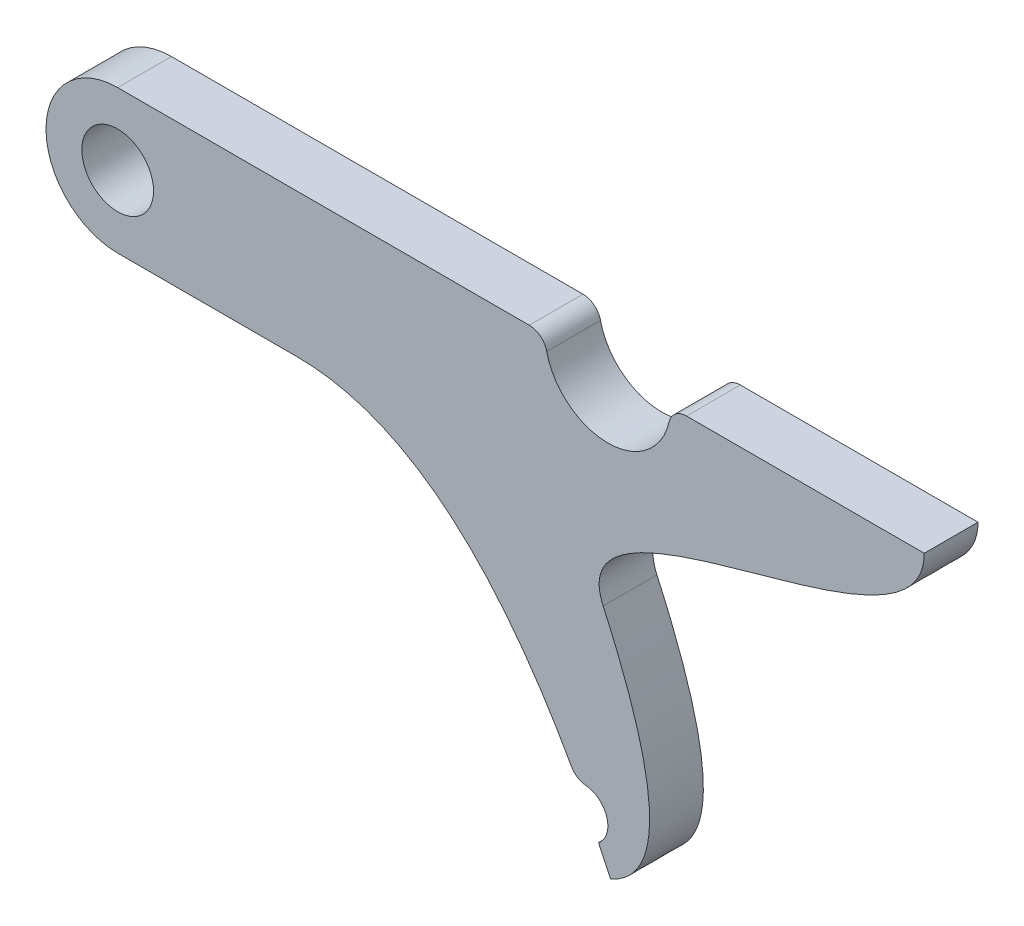
ISO-10303-21;
HEADER;
FILE_DESCRIPTION(('STEP AP214'),'2;1');
FILE_NAME('part.step','',(''),(''),'','','');
FILE_SCHEMA(('AUTOMOTIVE_DESIGN { 1 0 10303 214 1 1 1 1 }'));
ENDSEC;
DATA;
#1=APPLICATION_CONTEXT('core data for automotive mechanical design processes');
#2=APPLICATION_PROTOCOL_DEFINITION('international standard','automotive_design',2000,#1);
#3=PRODUCT_CONTEXT('',#1,'mechanical');
#4=PRODUCT('Part','Part','',(#3));
#5=PRODUCT_RELATED_PRODUCT_CATEGORY('part','',(#4));
#6=PRODUCT_DEFINITION_FORMATION('','',#4);
#7=PRODUCT_DEFINITION_CONTEXT('part definition',#1,'design');
#8=PRODUCT_DEFINITION('design','',#6,#7);
#9=PRODUCT_DEFINITION_SHAPE('','',#8);
#10=(LENGTH_UNIT() NAMED_UNIT(*) SI_UNIT(.MILLI.,.METRE.));
#11=(NAMED_UNIT(*) PLANE_ANGLE_UNIT() SI_UNIT($,.RADIAN.));
#12=(NAMED_UNIT(*) SI_UNIT($,.STERADIAN.) SOLID_ANGLE_UNIT());
#13=UNCERTAINTY_MEASURE_WITH_UNIT(LENGTH_MEASURE(1.E-05),#10,'distance_accuracy_value','');
#14=(GEOMETRIC_REPRESENTATION_CONTEXT(3) GLOBAL_UNCERTAINTY_ASSIGNED_CONTEXT((#13)) GLOBAL_UNIT_ASSIGNED_CONTEXT((#10,
#11,#12)) REPRESENTATION_CONTEXT('',''));
#15=CARTESIAN_POINT('',(0.,0.,0.));
#16=DIRECTION('',(0.,0.,1.));
#17=DIRECTION('',(1.,0.,0.));
#18=AXIS2_PLACEMENT_3D('',#15,#16,#17);
#19=CARTESIAN_POINT('',(0.,4.,3.));
#20=DIRECTION('',(0.,1.,0.));
#21=DIRECTION('',(0.,0.,1.));
#22=AXIS2_PLACEMENT_3D('',#19,#20,#21);
#23=PLANE('',#22);
#24=DIRECTION('',(1.,0.,0.));
#25=VECTOR('',#24,1.);
#26=CARTESIAN_POINT('',(0.,4.,3.));
#27=LINE('',#26,#25);
#28=CARTESIAN_POINT('',(0.,4.,3.));
#29=VERTEX_POINT('',#28);
#30=CARTESIAN_POINT('',(22.9625178063039,4.,3.));
#31=VERTEX_POINT('',#30);
#32=EDGE_CURVE('E131',#29,#31,#27,.T.);
#33=ORIENTED_EDGE('',*,*,#32,.T.);
#34=DIRECTION('',(0.,0.,-1.));
#35=VECTOR('',#34,1.);
#36=CARTESIAN_POINT('',(22.9625178063039,4.,0.));
#37=LINE('',#36,#35);
#38=CARTESIAN_POINT('',(22.9625178063039,4.,0.));
#39=VERTEX_POINT('',#38);
#40=EDGE_CURVE('E11',#31,#39,#37,.T.);
#41=ORIENTED_EDGE('',*,*,#40,.T.);
#42=DIRECTION('',(1.,0.,0.));
#43=VECTOR('',#42,1.);
#44=CARTESIAN_POINT('',(0.,4.,0.));
#45=LINE('',#44,#43);
#46=CARTESIAN_POINT('',(0.,4.,0.));
#47=VERTEX_POINT('',#46);
#48=EDGE_CURVE('E134',#47,#39,#45,.T.);
#49=ORIENTED_EDGE('',*,*,#48,.F.);
#50=DIRECTION('',(0.,0.,-1.));
#51=VECTOR('',#50,1.);
#52=CARTESIAN_POINT('',(0.,4.,3.));
#53=LINE('',#52,#51);
#54=EDGE_CURVE('E129',#29,#47,#53,.T.);
#55=ORIENTED_EDGE('',*,*,#54,.F.);
#56=EDGE_LOOP('',(#33,#41,#49,#55));
#57=FACE_BOUND('',#56,.T.);
#58=ADVANCED_FACE('F35',(#57),#23,.T.);
#59=CARTESIAN_POINT('',(31.7374821936961,4.,0.));
#60=VERTEX_POINT('',#59);
#61=CARTESIAN_POINT('',(45.,4.,0.));
#62=VERTEX_POINT('',#61);
#63=EDGE_CURVE('E343',#60,#62,#45,.T.);
#64=ORIENTED_EDGE('',*,*,#63,.F.);
#65=DIRECTION('',(0.,0.,-1.));
#66=VECTOR('',#65,1.);
#67=CARTESIAN_POINT('',(31.7374821936961,4.,3.));
#68=LINE('',#67,#66);
#69=CARTESIAN_POINT('',(31.7374821936961,4.,3.));
#70=VERTEX_POINT('',#69);
#71=EDGE_CURVE('E43',#60,#70,#68,.F.);
#72=ORIENTED_EDGE('',*,*,#71,.T.);
#73=CARTESIAN_POINT('',(45.,4.,3.));
#74=VERTEX_POINT('',#73);
#75=EDGE_CURVE('E149',#70,#74,#27,.T.);
#76=ORIENTED_EDGE('',*,*,#75,.T.);
#77=DIRECTION('',(0.,0.,-1.));
#78=VECTOR('',#77,1.);
#79=CARTESIAN_POINT('',(45.,4.,3.));
#80=LINE('',#79,#78);
#81=EDGE_CURVE('E333',#74,#62,#80,.T.);
#82=ORIENTED_EDGE('',*,*,#81,.T.);
#83=EDGE_LOOP('',(#64,#72,#76,#82));
#84=FACE_BOUND('',#83,.T.);
#85=ADVANCED_FACE('F187',(#84),#23,.T.);
#86=CARTESIAN_POINT('',(0.,0.,3.));
#87=DIRECTION('',(0.,0.,-1.));
#88=DIRECTION('',(-1.,0.,0.));
#89=AXIS2_PLACEMENT_3D('',#86,#87,#88);
#90=CYLINDRICAL_SURFACE('',#89,4.);
#91=CARTESIAN_POINT('',(0.,0.,0.));
#92=DIRECTION('',(0.,0.,1.));
#93=DIRECTION('',(1.,0.,0.));
#94=AXIS2_PLACEMENT_3D('',#91,#92,#93);
#95=CIRCLE('',#94,4.);
#96=CARTESIAN_POINT('',(0.,-4.,0.));
#97=VERTEX_POINT('',#96);
#98=EDGE_CURVE('E342',#47,#97,#95,.T.);
#99=ORIENTED_EDGE('',*,*,#98,.T.);
#100=DIRECTION('',(0.,0.,-1.));
#101=VECTOR('',#100,1.);
#102=CARTESIAN_POINT('',(0.,-4.,3.));
#103=LINE('',#102,#101);
#104=CARTESIAN_POINT('',(0.,-4.,3.));
#105=VERTEX_POINT('',#104);
#106=EDGE_CURVE('E138',#105,#97,#103,.T.);
#107=ORIENTED_EDGE('',*,*,#106,.F.);
#108=CARTESIAN_POINT('',(0.,0.,3.));
#109=DIRECTION('',(0.,0.,1.));
#110=DIRECTION('',(1.,0.,0.));
#111=AXIS2_PLACEMENT_3D('',#108,#109,#110);
#112=CIRCLE('',#111,4.);
#113=EDGE_CURVE('E141',#29,#105,#112,.T.);
#114=ORIENTED_EDGE('',*,*,#113,.F.);
#115=ORIENTED_EDGE('',*,*,#54,.T.);
#116=EDGE_LOOP('',(#99,#107,#114,#115));
#117=FACE_BOUND('',#116,.T.);
#118=ADVANCED_FACE('F142',(#117),#90,.T.);
#119=CARTESIAN_POINT('',(0.,-4.,3.));
#120=DIRECTION('',(0.,1.,0.));
#121=DIRECTION('',(0.,0.,1.));
#122=AXIS2_PLACEMENT_3D('',#119,#120,#121);
#123=PLANE('',#122);
#124=DIRECTION('',(1.,0.,0.));
#125=VECTOR('',#124,1.);
#126=CARTESIAN_POINT('',(0.,-4.,0.));
#127=LINE('',#126,#125);
#128=CARTESIAN_POINT('',(10.,-4.,0.));
#129=VERTEX_POINT('',#128);
#130=EDGE_CURVE('E345',#97,#129,#127,.T.);
#131=ORIENTED_EDGE('',*,*,#130,.T.);
#132=DIRECTION('',(0.,0.,-1.));
#133=VECTOR('',#132,1.);
#134=CARTESIAN_POINT('',(10.,-4.,3.));
#135=LINE('',#134,#133);
#136=CARTESIAN_POINT('',(10.,-4.,3.));
#137=VERTEX_POINT('',#136);
#138=EDGE_CURVE('E383',#137,#129,#135,.T.);
#139=ORIENTED_EDGE('',*,*,#138,.F.);
#140=DIRECTION('',(1.,0.,0.));
#141=VECTOR('',#140,1.);
#142=CARTESIAN_POINT('',(0.,-4.,3.));
#143=LINE('',#142,#141);
#144=EDGE_CURVE('E145',#105,#137,#143,.T.);
#145=ORIENTED_EDGE('',*,*,#144,.F.);
#146=ORIENTED_EDGE('',*,*,#106,.T.);
#147=EDGE_LOOP('',(#131,#139,#145,#146));
#148=FACE_BOUND('',#147,.T.);
#149=ADVANCED_FACE('F181',(#148),#123,.F.);
#150=CARTESIAN_POINT('',(10.,-4.,3.));
#151=CARTESIAN_POINT('',(20.,-4.,3.));
#152=CARTESIAN_POINT('',(27.5,-20.5,3.));
#153=B_SPLINE_CURVE_WITH_KNOTS('',2,(#150,#151,#152),.UNSPECIFIED.,.F.,.F.,(3,3),(0.,1.),.UNSPECIFIED.);
#154=DIRECTION('',(0.,0.,-1.));
#155=VECTOR('',#154,1.);
#156=SURFACE_OF_LINEAR_EXTRUSION('',#153,#155);
#157=CARTESIAN_POINT('',(10.,-4.,0.));
#158=CARTESIAN_POINT('',(20.,-4.,0.));
#159=CARTESIAN_POINT('',(27.5,-20.5,0.));
#160=B_SPLINE_CURVE_WITH_KNOTS('',2,(#157,#158,#159),.UNSPECIFIED.,.F.,.F.,(3,3),(0.,1.),.UNSPECIFIED.);
#161=CARTESIAN_POINT('',(25.3175861867431,-16.1430948860606,0.));
#162=VERTEX_POINT('',#161);
#163=EDGE_CURVE('E347',#129,#162,#160,.T.);
#164=ORIENTED_EDGE('',*,*,#163,.T.);
#165=DIRECTION('',(0.,0.,-1.));
#166=VECTOR('',#165,1.);
#167=CARTESIAN_POINT('',(25.3175861867427,-16.1430948860598,0.));
#168=LINE('',#167,#166);
#169=CARTESIAN_POINT('',(25.3175861867431,-16.1430948860606,3.));
#170=VERTEX_POINT('',#169);
#171=EDGE_CURVE('E398',#162,#170,#168,.F.);
#172=ORIENTED_EDGE('',*,*,#171,.T.);
#173=EDGE_CURVE('E157',#137,#170,#153,.T.);
#174=ORIENTED_EDGE('',*,*,#173,.F.);
#175=ORIENTED_EDGE('',*,*,#138,.T.);
#176=EDGE_LOOP('',(#164,#172,#174,#175));
#177=FACE_BOUND('',#176,.T.);
#178=ADVANCED_FACE('F176',(#177),#156,.F.);
#179=CARTESIAN_POINT('',(26.,-18.,3.));
#180=DIRECTION('',(0.,0.,-1.));
#181=DIRECTION('',(-1.,0.,0.));
#182=AXIS2_PLACEMENT_3D('',#179,#180,#181);
#183=CYLINDRICAL_SURFACE('',#182,1.35);
#184=CARTESIAN_POINT('',(26.,-18.,3.));
#185=DIRECTION('',(0.,0.,1.));
#186=DIRECTION('',(1.,0.,0.));
#187=AXIS2_PLACEMENT_3D('',#184,#185,#186);
#188=CIRCLE('',#187,1.35);
#189=CARTESIAN_POINT('',(26.8284055247011,-19.0659476003278,3.));
#190=VERTEX_POINT('',#189);
#191=CARTESIAN_POINT('',(26.1102786785099,-16.6545117566229,3.));
#192=VERTEX_POINT('',#191);
#193=EDGE_CURVE('E162',#190,#192,#188,.T.);
#194=ORIENTED_EDGE('',*,*,#193,.T.);
#195=DIRECTION('',(0.,0.,-1.));
#196=VECTOR('',#195,1.);
#197=CARTESIAN_POINT('',(26.1102786785099,-16.6545117566229,3.));
#198=LINE('',#197,#196);
#199=CARTESIAN_POINT('',(26.1102786785099,-16.6545117566229,0.));
#200=VERTEX_POINT('',#199);
#201=EDGE_CURVE('E389',#192,#200,#198,.T.);
#202=ORIENTED_EDGE('',*,*,#201,.T.);
#203=CARTESIAN_POINT('',(26.,-18.,0.));
#204=DIRECTION('',(0.,0.,1.));
#205=DIRECTION('',(1.,0.,0.));
#206=AXIS2_PLACEMENT_3D('',#203,#204,#205);
#207=CIRCLE('',#206,1.35);
#208=CARTESIAN_POINT('',(26.8284055247011,-19.0659476003278,0.));
#209=VERTEX_POINT('',#208);
#210=EDGE_CURVE('E352',#209,#200,#207,.T.);
#211=ORIENTED_EDGE('',*,*,#210,.F.);
#212=DIRECTION('',(0.,0.,-1.));
#213=VECTOR('',#212,1.);
#214=CARTESIAN_POINT('',(26.8284055247011,-19.0659476003278,3.));
#215=LINE('',#214,#213);
#216=EDGE_CURVE('E381',#190,#209,#215,.T.);
#217=ORIENTED_EDGE('',*,*,#216,.F.);
#218=EDGE_LOOP('',(#194,#202,#211,#217));
#219=FACE_BOUND('',#218,.T.);
#220=ADVANCED_FACE('F174',(#219),#183,.F.);
#221=CARTESIAN_POINT('',(27.5,-20.5,0.));
#222=VERTEX_POINT('',#221);
#223=EDGE_CURVE('E353',#209,#222,#160,.T.);
#224=ORIENTED_EDGE('',*,*,#223,.T.);
#225=DIRECTION('',(0.,0.,-1.));
#226=VECTOR('',#225,1.);
#227=CARTESIAN_POINT('',(27.5,-20.5,3.));
#228=LINE('',#227,#226);
#229=CARTESIAN_POINT('',(27.5,-20.5,3.));
#230=VERTEX_POINT('',#229);
#231=EDGE_CURVE('E378',#230,#222,#228,.T.);
#232=ORIENTED_EDGE('',*,*,#231,.F.);
#233=EDGE_CURVE('E163',#190,#230,#153,.T.);
#234=ORIENTED_EDGE('',*,*,#233,.F.);
#235=ORIENTED_EDGE('',*,*,#216,.T.);
#236=EDGE_LOOP('',(#224,#232,#234,#235));
#237=FACE_BOUND('',#236,.T.);
#238=ADVANCED_FACE('F169',(#237),#156,.F.);
#239=CARTESIAN_POINT('',(27.5,-20.5,3.));
#240=CARTESIAN_POINT('',(32.051832387313,-18.4309852784941,3.));
#241=CARTESIAN_POINT('',(27.0861970556988,-7.50658754894282,3.));
#242=B_SPLINE_CURVE_WITH_KNOTS('',2,(#239,#240,#241),.UNSPECIFIED.,.F.,.F.,(3,3),(0.,1.),.UNSPECIFIED.);
#243=DIRECTION('',(0.,0.,-1.));
#244=VECTOR('',#243,1.);
#245=SURFACE_OF_LINEAR_EXTRUSION('',#242,#244);
#246=CARTESIAN_POINT('',(27.5,-20.5,0.));
#247=CARTESIAN_POINT('',(32.051832387313,-18.4309852784941,0.));
#248=CARTESIAN_POINT('',(27.0861970556988,-7.50658754894282,0.));
#249=B_SPLINE_CURVE_WITH_KNOTS('',2,(#246,#247,#248),.UNSPECIFIED.,.F.,.F.,(3,3),(0.,1.),.UNSPECIFIED.);
#250=CARTESIAN_POINT('',(27.0861970556988,-7.50658754894282,0.));
#251=VERTEX_POINT('',#250);
#252=EDGE_CURVE('E359',#222,#251,#249,.T.);
#253=ORIENTED_EDGE('',*,*,#252,.T.);
#254=DIRECTION('',(0.,0.,-1.));
#255=VECTOR('',#254,1.);
#256=CARTESIAN_POINT('',(27.0861970556988,-7.50658754894282,3.));
#257=LINE('',#256,#255);
#258=CARTESIAN_POINT('',(27.0861970556988,-7.50658754894282,3.));
#259=VERTEX_POINT('',#258);
#260=EDGE_CURVE('E375',#259,#251,#257,.T.);
#261=ORIENTED_EDGE('',*,*,#260,.F.);
#262=EDGE_CURVE('E334',#230,#259,#242,.T.);
#263=ORIENTED_EDGE('',*,*,#262,.F.);
#264=ORIENTED_EDGE('',*,*,#231,.T.);
#265=EDGE_LOOP('',(#253,#261,#263,#264));
#266=FACE_BOUND('',#265,.T.);
#267=ADVANCED_FACE('F173',(#266),#245,.F.);
#268=CARTESIAN_POINT('',(27.0861970556988,-7.50658754894282,3.));
#269=CARTESIAN_POINT('',(25.4922936243612,-4.,3.));
#270=CARTESIAN_POINT('',(31.4922936243612,-1.5,3.));
#271=CARTESIAN_POINT('',(45.,-1.5,3.));
#272=CARTESIAN_POINT('',(45.,4.,3.));
#273=B_SPLINE_CURVE_WITH_KNOTS('',4,(#268,#269,#270,#271,#272),.UNSPECIFIED.,.F.,.F.,(5,5),(0.,
1.),.UNSPECIFIED.);
#274=DIRECTION('',(0.,0.,-1.));
#275=VECTOR('',#274,1.);
#276=SURFACE_OF_LINEAR_EXTRUSION('',#273,#275);
#277=CARTESIAN_POINT('',(27.0861970556988,-7.50658754894282,0.));
#278=CARTESIAN_POINT('',(25.4922936243612,-4.,0.));
#279=CARTESIAN_POINT('',(31.4922936243612,-1.5,0.));
#280=CARTESIAN_POINT('',(45.,-1.5,0.));
#281=CARTESIAN_POINT('',(45.,4.,0.));
#282=B_SPLINE_CURVE_WITH_KNOTS('',4,(#277,#278,#279,#280,#281),.UNSPECIFIED.,.F.,.F.,(5,5),(0.,
1.),.UNSPECIFIED.);
#283=EDGE_CURVE('E151',#251,#62,#282,.T.);
#284=ORIENTED_EDGE('',*,*,#283,.T.);
#285=ORIENTED_EDGE('',*,*,#81,.F.);
#286=EDGE_CURVE('E327',#259,#74,#273,.T.);
#287=ORIENTED_EDGE('',*,*,#286,.F.);
#288=ORIENTED_EDGE('',*,*,#260,.T.);
#289=EDGE_LOOP('',(#284,#285,#287,#288));
#290=FACE_BOUND('',#289,.T.);
#291=ADVANCED_FACE('F239',(#290),#276,.F.);
#292=CARTESIAN_POINT('',(0.,0.,3.));
#293=DIRECTION('',(0.,0.,1.));
#294=DIRECTION('',(1.,0.,0.));
#295=AXIS2_PLACEMENT_3D('',#292,#293,#294);
#296=PLANE('',#295);
#297=CARTESIAN_POINT('',(0.,0.,3.));
#298=DIRECTION('',(0.,0.,1.));
#299=DIRECTION('',(1.,0.,0.));
#300=AXIS2_PLACEMENT_3D('',#297,#298,#299);
#301=CIRCLE('',#300,2.);
#302=CARTESIAN_POINT('',(2.,0.,3.));
#303=VERTEX_POINT('',#302);
#304=EDGE_CURVE('E416',#303,#303,#301,.T.);
#305=ORIENTED_EDGE('',*,*,#304,.F.);
#306=EDGE_LOOP('',(#305));
#307=FACE_BOUND('',#306,.T.);
#308=ORIENTED_EDGE('',*,*,#173,.T.);
#309=CARTESIAN_POINT('',(26.1919665885173,-15.6578537985657,3.));
#310=DIRECTION('',(0.,0.,1.));
#311=DIRECTION('',(1.,0.,0.));
#312=AXIS2_PLACEMENT_3D('',#309,#310,#311);
#313=CIRCLE('',#312,1.);
#314=EDGE_CURVE('E403',#170,#192,#313,.T.);
#315=ORIENTED_EDGE('',*,*,#314,.T.);
#316=ORIENTED_EDGE('',*,*,#193,.F.);
#317=ORIENTED_EDGE('',*,*,#233,.T.);
#318=ORIENTED_EDGE('',*,*,#262,.T.);
#319=ORIENTED_EDGE('',*,*,#286,.T.);
#320=ORIENTED_EDGE('',*,*,#75,.F.);
#321=CARTESIAN_POINT('',(31.7374821936961,3.,3.));
#322=DIRECTION('',(0.,0.,1.));
#323=DIRECTION('',(1.,0.,0.));
#324=AXIS2_PLACEMENT_3D('',#321,#322,#323);
#325=CIRCLE('',#324,1.);
#326=CARTESIAN_POINT('',(30.7624861506525,3.22222222222222,3.));
#327=VERTEX_POINT('',#326);
#328=EDGE_CURVE('E401',#70,#327,#325,.T.);
#329=ORIENTED_EDGE('',*,*,#328,.T.);
#330=CARTESIAN_POINT('',(27.35,4.,3.));
#331=DIRECTION('',(0.,0.,1.));
#332=DIRECTION('',(1.,0.,0.));
#333=AXIS2_PLACEMENT_3D('',#330,#331,#332);
#334=CIRCLE('',#333,3.5);
#335=CARTESIAN_POINT('',(23.9375138493475,3.22222222222222,3.));
#336=VERTEX_POINT('',#335);
#337=EDGE_CURVE('E153',#336,#327,#334,.T.);
#338=ORIENTED_EDGE('',*,*,#337,.F.);
#339=CARTESIAN_POINT('',(22.9625178063039,3.,3.));
#340=DIRECTION('',(0.,0.,1.));
#341=DIRECTION('',(1.,0.,0.));
#342=AXIS2_PLACEMENT_3D('',#339,#340,#341);
#343=CIRCLE('',#342,1.);
#344=EDGE_CURVE('E57',#336,#31,#343,.T.);
#345=ORIENTED_EDGE('',*,*,#344,.T.);
#346=ORIENTED_EDGE('',*,*,#32,.F.);
#347=ORIENTED_EDGE('',*,*,#113,.T.);
#348=ORIENTED_EDGE('',*,*,#144,.T.);
#349=EDGE_LOOP('',(#308,#315,#316,#317,#318,#319,#320,#329,#338,#345,#346,#347,#348));
#350=FACE_BOUND('',#349,.T.);
#351=ADVANCED_FACE('F148',(#307,#350),#296,.T.);
#352=CARTESIAN_POINT('',(0.,0.,0.));
#353=DIRECTION('',(0.,0.,1.));
#354=DIRECTION('',(1.,0.,0.));
#355=AXIS2_PLACEMENT_3D('',#352,#353,#354);
#356=PLANE('',#355);
#357=CARTESIAN_POINT('',(0.,0.,0.));
#358=DIRECTION('',(0.,0.,1.));
#359=DIRECTION('',(1.,0.,0.));
#360=AXIS2_PLACEMENT_3D('',#357,#358,#359);
#361=CIRCLE('',#360,2.);
#362=CARTESIAN_POINT('',(2.,0.,0.));
#363=VERTEX_POINT('',#362);
#364=EDGE_CURVE('E418',#363,#363,#361,.T.);
#365=ORIENTED_EDGE('',*,*,#364,.T.);
#366=EDGE_LOOP('',(#365));
#367=FACE_BOUND('',#366,.T.);
#368=ORIENTED_EDGE('',*,*,#210,.T.);
#369=CARTESIAN_POINT('',(26.1919665885173,-15.6578537985657,0.));
#370=DIRECTION('',(0.,0.,1.));
#371=DIRECTION('',(1.,0.,0.));
#372=AXIS2_PLACEMENT_3D('',#369,#370,#371);
#373=CIRCLE('',#372,1.);
#374=EDGE_CURVE('E396',#200,#162,#373,.F.);
#375=ORIENTED_EDGE('',*,*,#374,.T.);
#376=ORIENTED_EDGE('',*,*,#163,.F.);
#377=ORIENTED_EDGE('',*,*,#130,.F.);
#378=ORIENTED_EDGE('',*,*,#98,.F.);
#379=ORIENTED_EDGE('',*,*,#48,.T.);
#380=CARTESIAN_POINT('',(22.9625178063039,3.,0.));
#381=DIRECTION('',(0.,0.,1.));
#382=DIRECTION('',(1.,0.,0.));
#383=AXIS2_PLACEMENT_3D('',#380,#381,#382);
#384=CIRCLE('',#383,1.);
#385=CARTESIAN_POINT('',(23.9375138493475,3.22222222222222,0.));
#386=VERTEX_POINT('',#385);
#387=EDGE_CURVE('E392',#39,#386,#384,.F.);
#388=ORIENTED_EDGE('',*,*,#387,.T.);
#389=CARTESIAN_POINT('',(27.35,4.,0.));
#390=DIRECTION('',(0.,0.,1.));
#391=DIRECTION('',(1.,0.,0.));
#392=AXIS2_PLACEMENT_3D('',#389,#390,#391);
#393=CIRCLE('',#392,3.5);
#394=CARTESIAN_POINT('',(30.7624861506525,3.22222222222222,0.));
#395=VERTEX_POINT('',#394);
#396=EDGE_CURVE('E137',#386,#395,#393,.T.);
#397=ORIENTED_EDGE('',*,*,#396,.T.);
#398=CARTESIAN_POINT('',(31.7374821936961,3.,0.));
#399=DIRECTION('',(0.,0.,1.));
#400=DIRECTION('',(1.,0.,0.));
#401=AXIS2_PLACEMENT_3D('',#398,#399,#400);
#402=CIRCLE('',#401,1.);
#403=EDGE_CURVE('E394',#395,#60,#402,.F.);
#404=ORIENTED_EDGE('',*,*,#403,.T.);
#405=ORIENTED_EDGE('',*,*,#63,.T.);
#406=ORIENTED_EDGE('',*,*,#283,.F.);
#407=ORIENTED_EDGE('',*,*,#252,.F.);
#408=ORIENTED_EDGE('',*,*,#223,.F.);
#409=EDGE_LOOP('',(#368,#375,#376,#377,#378,#379,#388,#397,#404,#405,#406,#407,#408));
#410=FACE_BOUND('',#409,.T.);
#411=ADVANCED_FACE('F251',(#367,#410),#356,.F.);
#412=CARTESIAN_POINT('',(27.35,4.,0.));
#413=DIRECTION('',(0.,0.,1.));
#414=DIRECTION('',(1.,0.,0.));
#415=AXIS2_PLACEMENT_3D('',#412,#413,#414);
#416=CYLINDRICAL_SURFACE('',#415,3.5);
#417=ORIENTED_EDGE('',*,*,#337,.T.);
#418=DIRECTION('',(0.,0.,1.));
#419=VECTOR('',#418,1.);
#420=CARTESIAN_POINT('',(30.7624861506525,3.22222222222222,0.));
#421=LINE('',#420,#419);
#422=EDGE_CURVE('E408',#327,#395,#421,.F.);
#423=ORIENTED_EDGE('',*,*,#422,.T.);
#424=ORIENTED_EDGE('',*,*,#396,.F.);
#425=DIRECTION('',(0.,0.,1.));
#426=VECTOR('',#425,1.);
#427=CARTESIAN_POINT('',(23.9375138493475,3.22222222222222,0.));
#428=LINE('',#427,#426);
#429=EDGE_CURVE('E405',#386,#336,#428,.T.);
#430=ORIENTED_EDGE('',*,*,#429,.T.);
#431=EDGE_LOOP('',(#417,#423,#424,#430));
#432=FACE_BOUND('',#431,.T.);
#433=ADVANCED_FACE('F259',(#432),#416,.F.);
#434=CARTESIAN_POINT('',(0.,0.,0.));
#435=DIRECTION('',(0.,0.,1.));
#436=DIRECTION('',(1.,0.,0.));
#437=AXIS2_PLACEMENT_3D('',#434,#435,#436);
#438=CYLINDRICAL_SURFACE('',#437,2.);
#439=ORIENTED_EDGE('',*,*,#364,.F.);
#440=EDGE_LOOP('',(#439));
#441=FACE_BOUND('',#440,.T.);
#442=ORIENTED_EDGE('',*,*,#304,.T.);
#443=EDGE_LOOP('',(#442));
#444=FACE_BOUND('',#443,.T.);
#445=ADVANCED_FACE('F193',(#441,#444),#438,.F.);
#446=CARTESIAN_POINT('',(26.1919665885173,-15.6578537985657,1.5));
#447=DIRECTION('',(0.,0.,-1.));
#448=DIRECTION('',(-1.,0.,0.));
#449=AXIS2_PLACEMENT_3D('',#446,#447,#448);
#450=CYLINDRICAL_SURFACE('',#449,1.);
#451=ORIENTED_EDGE('',*,*,#314,.F.);
#452=ORIENTED_EDGE('',*,*,#171,.F.);
#453=ORIENTED_EDGE('',*,*,#374,.F.);
#454=ORIENTED_EDGE('',*,*,#201,.F.);
#455=EDGE_LOOP('',(#451,#452,#453,#454));
#456=FACE_BOUND('',#455,.T.);
#457=ADVANCED_FACE('F190',(#456),#450,.T.);
#458=CARTESIAN_POINT('',(31.7374821936961,3.,0.));
#459=DIRECTION('',(0.,0.,1.));
#460=DIRECTION('',(1.,0.,0.));
#461=AXIS2_PLACEMENT_3D('',#458,#459,#460);
#462=CYLINDRICAL_SURFACE('',#461,1.);
#463=ORIENTED_EDGE('',*,*,#328,.F.);
#464=ORIENTED_EDGE('',*,*,#71,.F.);
#465=ORIENTED_EDGE('',*,*,#403,.F.);
#466=ORIENTED_EDGE('',*,*,#422,.F.);
#467=EDGE_LOOP('',(#463,#464,#465,#466));
#468=FACE_BOUND('',#467,.T.);
#469=ADVANCED_FACE('F192',(#468),#462,.T.);
#470=CARTESIAN_POINT('',(22.9625178063039,3.,0.));
#471=DIRECTION('',(0.,0.,1.));
#472=DIRECTION('',(1.,0.,0.));
#473=AXIS2_PLACEMENT_3D('',#470,#471,#472);
#474=CYLINDRICAL_SURFACE('',#473,1.);
#475=ORIENTED_EDGE('',*,*,#387,.F.);
#476=ORIENTED_EDGE('',*,*,#40,.F.);
#477=ORIENTED_EDGE('',*,*,#344,.F.);
#478=ORIENTED_EDGE('',*,*,#429,.F.);
#479=EDGE_LOOP('',(#475,#476,#477,#478));
#480=FACE_BOUND('',#479,.T.);
#481=ADVANCED_FACE('F37',(#480),#474,.T.);
#482=CLOSED_SHELL('',(#58,#85,#118,#149,#178,#220,#238,#267,#291,#351,#411,#433,#445,#457,#469,#481));
#483=MANIFOLD_SOLID_BREP('B2',#482);
#484=ADVANCED_BREP_SHAPE_REPRESENTATION('',(#18,#483),#14);
#485=SHAPE_DEFINITION_REPRESENTATION(#9,#484);
ENDSEC;
END-ISO-10303-21;
